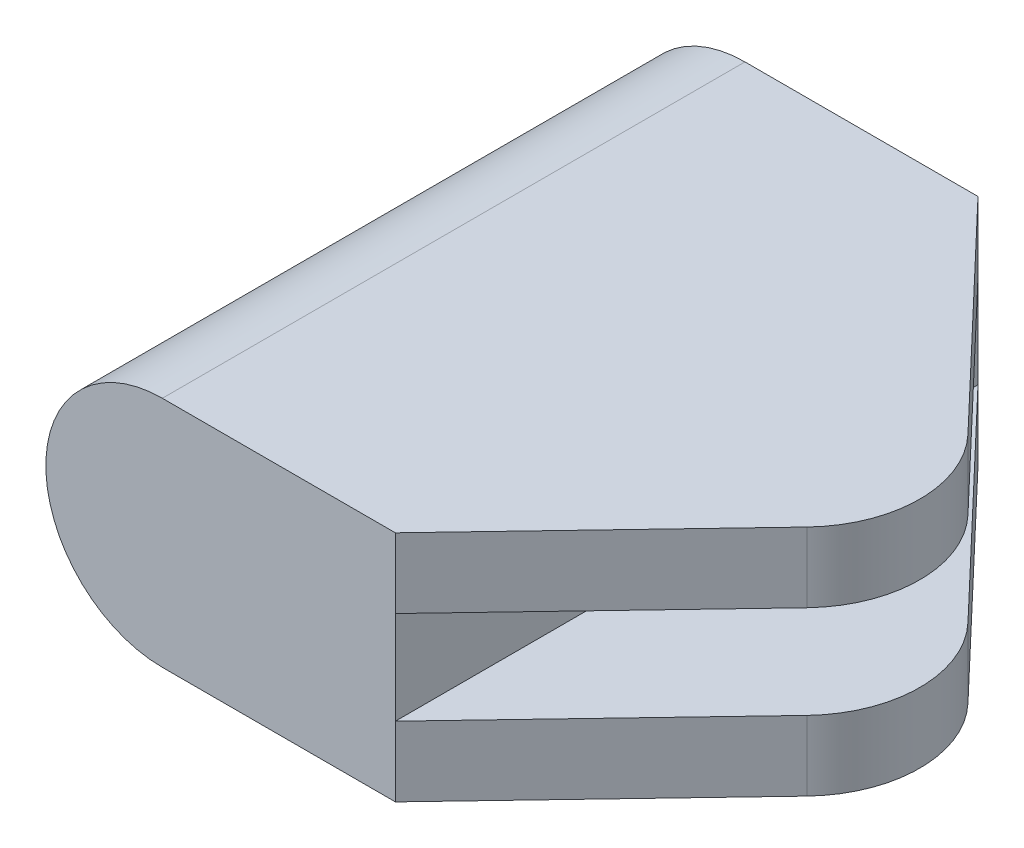
ISO-10303-21;
HEADER;
FILE_DESCRIPTION(('STEP AP214'),'2;1');
FILE_NAME('part.step','',(''),(''),'','','');
FILE_SCHEMA(('AUTOMOTIVE_DESIGN { 1 0 10303 214 1 1 1 1 }'));
ENDSEC;
DATA;
#1=APPLICATION_CONTEXT('core data for automotive mechanical design processes');
#2=APPLICATION_PROTOCOL_DEFINITION('international standard','automotive_design',2000,#1);
#3=PRODUCT_CONTEXT('',#1,'mechanical');
#4=PRODUCT('Part','Part','',(#3));
#5=PRODUCT_RELATED_PRODUCT_CATEGORY('part','',(#4));
#6=PRODUCT_DEFINITION_FORMATION('','',#4);
#7=PRODUCT_DEFINITION_CONTEXT('part definition',#1,'design');
#8=PRODUCT_DEFINITION('design','',#6,#7);
#9=PRODUCT_DEFINITION_SHAPE('','',#8);
#10=(LENGTH_UNIT() NAMED_UNIT(*) SI_UNIT(.MILLI.,.METRE.));
#11=(NAMED_UNIT(*) PLANE_ANGLE_UNIT() SI_UNIT($,.RADIAN.));
#12=(NAMED_UNIT(*) SI_UNIT($,.STERADIAN.) SOLID_ANGLE_UNIT());
#13=UNCERTAINTY_MEASURE_WITH_UNIT(LENGTH_MEASURE(1.E-05),#10,'distance_accuracy_value','');
#14=(GEOMETRIC_REPRESENTATION_CONTEXT(3) GLOBAL_UNCERTAINTY_ASSIGNED_CONTEXT((#13)) GLOBAL_UNIT_ASSIGNED_CONTEXT((#10,
#11,#12)) REPRESENTATION_CONTEXT('',''));
#15=CARTESIAN_POINT('',(0.,0.,0.));
#16=DIRECTION('',(0.,0.,1.));
#17=DIRECTION('',(1.,0.,0.));
#18=AXIS2_PLACEMENT_3D('',#15,#16,#17);
#19=CARTESIAN_POINT('',(60.,-80.,50.));
#20=DIRECTION('',(0.,1.,0.));
#21=DIRECTION('',(-1.,0.,0.));
#22=AXIS2_PLACEMENT_3D('',#19,#20,#21);
#23=CYLINDRICAL_SURFACE('',#22,19.9999997348555);
#24=CARTESIAN_POINT('',(60.,-8.00000000000001,50.));
#25=DIRECTION('',(0.,1.,0.));
#26=DIRECTION('',(0.,0.,1.));
#27=AXIS2_PLACEMENT_3D('',#24,#25,#26);
#28=CIRCLE('',#27,19.9999997348555);
#29=CARTESIAN_POINT('',(74.4827585018317,-8.00000000000001,63.7931031886171));
#30=VERTEX_POINT('',#29);
#31=CARTESIAN_POINT('',(74.4827585018318,-8.00000000000001,36.2068968113829));
#32=VERTEX_POINT('',#31);
#33=EDGE_CURVE('E116',#30,#32,#28,.T.);
#34=ORIENTED_EDGE('',*,*,#33,.F.);
#35=DIRECTION('',(0.,1.,0.));
#36=VECTOR('',#35,1.);
#37=CARTESIAN_POINT('',(74.4827585018317,-80.,63.7931031886171));
#38=LINE('',#37,#36);
#39=CARTESIAN_POINT('',(74.4827585018318,-20.,63.7931031886171));
#40=VERTEX_POINT('',#39);
#41=EDGE_CURVE('E159',#40,#30,#38,.T.);
#42=ORIENTED_EDGE('',*,*,#41,.F.);
#43=CARTESIAN_POINT('',(60.,-20.,50.));
#44=DIRECTION('',(0.,1.,0.));
#45=DIRECTION('',(-1.,0.,0.));
#46=AXIS2_PLACEMENT_3D('',#43,#44,#45);
#47=CIRCLE('',#46,19.9999997348555);
#48=CARTESIAN_POINT('',(74.4827585018318,-20.,36.2068968113829));
#49=VERTEX_POINT('',#48);
#50=EDGE_CURVE('E169',#49,#40,#47,.F.);
#51=ORIENTED_EDGE('',*,*,#50,.F.);
#52=DIRECTION('',(0.,1.,0.));
#53=VECTOR('',#52,1.);
#54=CARTESIAN_POINT('',(74.4827585018317,-80.,36.2068968113829));
#55=LINE('',#54,#53);
#56=EDGE_CURVE('E163',#49,#32,#55,.T.);
#57=ORIENTED_EDGE('',*,*,#56,.T.);
#58=EDGE_LOOP('',(#34,#42,#51,#57));
#59=FACE_BOUND('',#58,.T.);
#60=ADVANCED_FACE('F34',(#59),#23,.T.);
#61=CARTESIAN_POINT('',(40.,-80.,100.));
#62=DIRECTION('',(-0.724137934691649,0.,-0.689655168573769));
#63=DIRECTION('',(-0.689655168573769,0.,0.724137934691649));
#64=AXIS2_PLACEMENT_3D('',#61,#62,#63);
#65=PLANE('',#64);
#66=DIRECTION('',(0.689655168573769,0.,-0.724137934691649));
#67=VECTOR('',#66,1.);
#68=CARTESIAN_POINT('',(40.,-8.00000000000001,100.));
#69=LINE('',#68,#67);
#70=CARTESIAN_POINT('',(40.,-8.,100.));
#71=VERTEX_POINT('',#70);
#72=EDGE_CURVE('E147',#71,#30,#69,.T.);
#73=ORIENTED_EDGE('',*,*,#72,.F.);
#74=DIRECTION('',(0.,-1.,0.));
#75=VECTOR('',#74,1.);
#76=CARTESIAN_POINT('',(40.,0.,100.));
#77=LINE('',#76,#75);
#78=CARTESIAN_POINT('',(40.,-20.,100.));
#79=VERTEX_POINT('',#78);
#80=EDGE_CURVE('E191',#71,#79,#77,.T.);
#81=ORIENTED_EDGE('',*,*,#80,.T.);
#82=DIRECTION('',(-0.689655168573769,0.,0.724137934691649));
#83=VECTOR('',#82,1.);
#84=CARTESIAN_POINT('',(59.0249700616205,-20.,80.0237812231828));
#85=LINE('',#84,#83);
#86=EDGE_CURVE('E166',#40,#79,#85,.T.);
#87=ORIENTED_EDGE('',*,*,#86,.F.);
#88=ORIENTED_EDGE('',*,*,#41,.T.);
#89=EDGE_LOOP('',(#73,#81,#87,#88));
#90=FACE_BOUND('',#89,.T.);
#91=ADVANCED_FACE('F213',(#90),#65,.F.);
#92=CARTESIAN_POINT('',(40.,-80.,0.));
#93=DIRECTION('',(-0.724137934691649,0.,0.689655168573768));
#94=DIRECTION('',(0.689655168573769,0.,0.724137934691649));
#95=AXIS2_PLACEMENT_3D('',#92,#93,#94);
#96=PLANE('',#95);
#97=DIRECTION('',(-0.689655168573769,0.,-0.724137934691649));
#98=VECTOR('',#97,1.);
#99=CARTESIAN_POINT('',(40.,-8.00000000000001,0.));
#100=LINE('',#99,#98);
#101=CARTESIAN_POINT('',(40.,-8.,0.));
#102=VERTEX_POINT('',#101);
#103=EDGE_CURVE('E11',#32,#102,#100,.T.);
#104=ORIENTED_EDGE('',*,*,#103,.F.);
#105=ORIENTED_EDGE('',*,*,#56,.F.);
#106=DIRECTION('',(0.689655168573769,0.,0.724137934691649));
#107=VECTOR('',#106,1.);
#108=CARTESIAN_POINT('',(108.965517003663,-20.,72.4137936227659));
#109=LINE('',#108,#107);
#110=CARTESIAN_POINT('',(40.,-20.,0.));
#111=VERTEX_POINT('',#110);
#112=EDGE_CURVE('E129',#111,#49,#109,.T.);
#113=ORIENTED_EDGE('',*,*,#112,.F.);
#114=DIRECTION('',(0.,-1.,0.));
#115=VECTOR('',#114,1.);
#116=CARTESIAN_POINT('',(40.,0.,0.));
#117=LINE('',#116,#115);
#118=EDGE_CURVE('E57',#102,#111,#117,.T.);
#119=ORIENTED_EDGE('',*,*,#118,.F.);
#120=EDGE_LOOP('',(#104,#105,#113,#119));
#121=FACE_BOUND('',#120,.T.);
#122=ADVANCED_FACE('F127',(#121),#96,.F.);
#123=CARTESIAN_POINT('',(0.,0.,100.));
#124=DIRECTION('',(0.,0.,-1.));
#125=DIRECTION('',(-1.,0.,0.));
#126=AXIS2_PLACEMENT_3D('',#123,#124,#125);
#127=CYLINDRICAL_SURFACE('',#126,20.);
#128=CARTESIAN_POINT('',(0.,0.,0.));
#129=DIRECTION('',(0.,0.,1.));
#130=DIRECTION('',(1.,0.,0.));
#131=AXIS2_PLACEMENT_3D('',#128,#129,#130);
#132=CIRCLE('',#131,20.);
#133=CARTESIAN_POINT('',(0.,20.,0.));
#134=VERTEX_POINT('',#133);
#135=CARTESIAN_POINT('',(0.,-20.,0.));
#136=VERTEX_POINT('',#135);
#137=EDGE_CURVE('E171',#134,#136,#132,.T.);
#138=ORIENTED_EDGE('',*,*,#137,.T.);
#139=DIRECTION('',(0.,0.,-1.));
#140=VECTOR('',#139,1.);
#141=CARTESIAN_POINT('',(0.,-20.,100.));
#142=LINE('',#141,#140);
#143=CARTESIAN_POINT('',(0.,-20.,100.));
#144=VERTEX_POINT('',#143);
#145=EDGE_CURVE('E132',#144,#136,#142,.T.);
#146=ORIENTED_EDGE('',*,*,#145,.F.);
#147=CARTESIAN_POINT('',(0.,0.,100.));
#148=DIRECTION('',(0.,0.,1.));
#149=DIRECTION('',(1.,0.,0.));
#150=AXIS2_PLACEMENT_3D('',#147,#148,#149);
#151=CIRCLE('',#150,20.);
#152=CARTESIAN_POINT('',(0.,20.,100.));
#153=VERTEX_POINT('',#152);
#154=EDGE_CURVE('E172',#153,#144,#151,.T.);
#155=ORIENTED_EDGE('',*,*,#154,.F.);
#156=DIRECTION('',(0.,0.,-1.));
#157=VECTOR('',#156,1.);
#158=CARTESIAN_POINT('',(0.,20.,100.));
#159=LINE('',#158,#157);
#160=EDGE_CURVE('E181',#153,#134,#159,.T.);
#161=ORIENTED_EDGE('',*,*,#160,.T.);
#162=EDGE_LOOP('',(#138,#146,#155,#161));
#163=FACE_BOUND('',#162,.T.);
#164=ADVANCED_FACE('F36',(#163),#127,.T.);
#165=CARTESIAN_POINT('',(80.,-20.,100.));
#166=DIRECTION('',(0.,1.,0.));
#167=DIRECTION('',(-1.,0.,0.));
#168=AXIS2_PLACEMENT_3D('',#165,#166,#167);
#169=PLANE('',#168);
#170=ORIENTED_EDGE('',*,*,#50,.T.);
#171=ORIENTED_EDGE('',*,*,#86,.T.);
#172=DIRECTION('',(1.,0.,0.));
#173=VECTOR('',#172,1.);
#174=CARTESIAN_POINT('',(80.,-20.,100.));
#175=LINE('',#174,#173);
#176=EDGE_CURVE('E175',#144,#79,#175,.T.);
#177=ORIENTED_EDGE('',*,*,#176,.F.);
#178=ORIENTED_EDGE('',*,*,#145,.T.);
#179=DIRECTION('',(1.,0.,0.));
#180=VECTOR('',#179,1.);
#181=CARTESIAN_POINT('',(80.,-20.,0.));
#182=LINE('',#181,#180);
#183=EDGE_CURVE('E184',#136,#111,#182,.T.);
#184=ORIENTED_EDGE('',*,*,#183,.T.);
#185=ORIENTED_EDGE('',*,*,#112,.T.);
#186=EDGE_LOOP('',(#170,#171,#177,#178,#184,#185));
#187=FACE_BOUND('',#186,.T.);
#188=ADVANCED_FACE('F216',(#187),#169,.F.);
#189=CARTESIAN_POINT('',(0.,20.,100.));
#190=DIRECTION('',(0.,-1.,0.));
#191=DIRECTION('',(1.,0.,0.));
#192=AXIS2_PLACEMENT_3D('',#189,#190,#191);
#193=PLANE('',#192);
#194=DIRECTION('',(-1.,0.,0.));
#195=VECTOR('',#194,1.);
#196=CARTESIAN_POINT('',(0.,20.,100.));
#197=LINE('',#196,#195);
#198=CARTESIAN_POINT('',(40.,20.,100.));
#199=VERTEX_POINT('',#198);
#200=EDGE_CURVE('E179',#199,#153,#197,.T.);
#201=ORIENTED_EDGE('',*,*,#200,.F.);
#202=DIRECTION('',(-0.689655168573769,0.,0.724137934691649));
#203=VECTOR('',#202,1.);
#204=CARTESIAN_POINT('',(40.,20.,100.));
#205=LINE('',#204,#203);
#206=CARTESIAN_POINT('',(74.4827585018318,20.,63.7931031886171));
#207=VERTEX_POINT('',#206);
#208=EDGE_CURVE('E156',#207,#199,#205,.T.);
#209=ORIENTED_EDGE('',*,*,#208,.F.);
#210=CARTESIAN_POINT('',(60.,20.,50.));
#211=DIRECTION('',(0.,-1.,0.));
#212=DIRECTION('',(-1.,0.,0.));
#213=AXIS2_PLACEMENT_3D('',#210,#211,#212);
#214=CIRCLE('',#213,19.9999997348555);
#215=CARTESIAN_POINT('',(74.4827585018318,20.,36.2068968113829));
#216=VERTEX_POINT('',#215);
#217=EDGE_CURVE('E153',#216,#207,#214,.T.);
#218=ORIENTED_EDGE('',*,*,#217,.F.);
#219=DIRECTION('',(0.689655168573768,0.,0.724137934691649));
#220=VECTOR('',#219,1.);
#221=CARTESIAN_POINT('',(40.,20.,0.));
#222=LINE('',#221,#220);
#223=CARTESIAN_POINT('',(40.,20.,0.));
#224=VERTEX_POINT('',#223);
#225=EDGE_CURVE('E150',#224,#216,#222,.T.);
#226=ORIENTED_EDGE('',*,*,#225,.F.);
#227=DIRECTION('',(-1.,0.,0.));
#228=VECTOR('',#227,1.);
#229=CARTESIAN_POINT('',(0.,20.,0.));
#230=LINE('',#229,#228);
#231=EDGE_CURVE('E176',#224,#134,#230,.T.);
#232=ORIENTED_EDGE('',*,*,#231,.T.);
#233=ORIENTED_EDGE('',*,*,#160,.F.);
#234=EDGE_LOOP('',(#201,#209,#218,#226,#232,#233));
#235=FACE_BOUND('',#234,.T.);
#236=ADVANCED_FACE('F234',(#235),#193,.F.);
#237=CARTESIAN_POINT('',(0.,0.,100.));
#238=DIRECTION('',(0.,0.,1.));
#239=DIRECTION('',(1.,0.,0.));
#240=AXIS2_PLACEMENT_3D('',#237,#238,#239);
#241=PLANE('',#240);
#242=CARTESIAN_POINT('',(40.,8.,100.));
#243=VERTEX_POINT('',#242);
#244=EDGE_CURVE('E192',#199,#243,#77,.T.);
#245=ORIENTED_EDGE('',*,*,#244,.F.);
#246=ORIENTED_EDGE('',*,*,#200,.T.);
#247=ORIENTED_EDGE('',*,*,#154,.T.);
#248=ORIENTED_EDGE('',*,*,#176,.T.);
#249=ORIENTED_EDGE('',*,*,#80,.F.);
#250=DIRECTION('',(0.,1.,0.));
#251=VECTOR('',#250,1.);
#252=CARTESIAN_POINT('',(40.,-80.,100.));
#253=LINE('',#252,#251);
#254=EDGE_CURVE('E125',#71,#243,#253,.T.);
#255=ORIENTED_EDGE('',*,*,#254,.T.);
#256=EDGE_LOOP('',(#245,#246,#247,#248,#249,#255));
#257=FACE_BOUND('',#256,.T.);
#258=ADVANCED_FACE('F209',(#257),#241,.T.);
#259=CARTESIAN_POINT('',(0.,0.,0.));
#260=DIRECTION('',(0.,0.,1.));
#261=DIRECTION('',(1.,0.,0.));
#262=AXIS2_PLACEMENT_3D('',#259,#260,#261);
#263=PLANE('',#262);
#264=ORIENTED_EDGE('',*,*,#231,.F.);
#265=CARTESIAN_POINT('',(40.,8.00000000000001,0.));
#266=VERTEX_POINT('',#265);
#267=EDGE_CURVE('E131',#224,#266,#117,.T.);
#268=ORIENTED_EDGE('',*,*,#267,.T.);
#269=DIRECTION('',(0.,1.,0.));
#270=VECTOR('',#269,1.);
#271=CARTESIAN_POINT('',(40.,-8.,0.));
#272=LINE('',#271,#270);
#273=EDGE_CURVE('E122',#102,#266,#272,.T.);
#274=ORIENTED_EDGE('',*,*,#273,.F.);
#275=ORIENTED_EDGE('',*,*,#118,.T.);
#276=ORIENTED_EDGE('',*,*,#183,.F.);
#277=ORIENTED_EDGE('',*,*,#137,.F.);
#278=EDGE_LOOP('',(#264,#268,#274,#275,#276,#277));
#279=FACE_BOUND('',#278,.T.);
#280=ADVANCED_FACE('F136',(#279),#263,.F.);
#281=CARTESIAN_POINT('',(74.4827585018317,8.00000000000001,63.7931031886171));
#282=VERTEX_POINT('',#281);
#283=EDGE_CURVE('E162',#282,#207,#38,.T.);
#284=ORIENTED_EDGE('',*,*,#283,.F.);
#285=CARTESIAN_POINT('',(60.,8.00000000000001,50.));
#286=DIRECTION('',(0.,1.,0.));
#287=DIRECTION('',(0.,0.,1.));
#288=AXIS2_PLACEMENT_3D('',#285,#286,#287);
#289=CIRCLE('',#288,19.9999997348555);
#290=CARTESIAN_POINT('',(74.4827585018318,8.00000000000001,36.2068968113829));
#291=VERTEX_POINT('',#290);
#292=EDGE_CURVE('E137',#282,#291,#289,.T.);
#293=ORIENTED_EDGE('',*,*,#292,.T.);
#294=EDGE_CURVE('E158',#291,#216,#55,.T.);
#295=ORIENTED_EDGE('',*,*,#294,.T.);
#296=ORIENTED_EDGE('',*,*,#217,.T.);
#297=EDGE_LOOP('',(#284,#293,#295,#296));
#298=FACE_BOUND('',#297,.T.);
#299=ADVANCED_FACE('F201',(#298),#23,.T.);
#300=ORIENTED_EDGE('',*,*,#244,.T.);
#301=DIRECTION('',(0.689655168573769,0.,-0.724137934691649));
#302=VECTOR('',#301,1.);
#303=CARTESIAN_POINT('',(40.,8.00000000000001,100.));
#304=LINE('',#303,#302);
#305=EDGE_CURVE('E140',#243,#282,#304,.T.);
#306=ORIENTED_EDGE('',*,*,#305,.T.);
#307=ORIENTED_EDGE('',*,*,#283,.T.);
#308=ORIENTED_EDGE('',*,*,#208,.T.);
#309=EDGE_LOOP('',(#300,#306,#307,#308));
#310=FACE_BOUND('',#309,.T.);
#311=ADVANCED_FACE('F205',(#310),#65,.F.);
#312=ORIENTED_EDGE('',*,*,#294,.F.);
#313=DIRECTION('',(-0.689655168573769,0.,-0.724137934691649));
#314=VECTOR('',#313,1.);
#315=CARTESIAN_POINT('',(40.,8.00000000000001,0.));
#316=LINE('',#315,#314);
#317=EDGE_CURVE('E42',#291,#266,#316,.T.);
#318=ORIENTED_EDGE('',*,*,#317,.T.);
#319=ORIENTED_EDGE('',*,*,#267,.F.);
#320=ORIENTED_EDGE('',*,*,#225,.T.);
#321=EDGE_LOOP('',(#312,#318,#319,#320));
#322=FACE_BOUND('',#321,.T.);
#323=ADVANCED_FACE('F196',(#322),#96,.F.);
#324=CARTESIAN_POINT('',(40.,-8.,0.));
#325=DIRECTION('',(-1.,0.,0.));
#326=DIRECTION('',(0.,0.,1.));
#327=AXIS2_PLACEMENT_3D('',#324,#325,#326);
#328=PLANE('',#327);
#329=DIRECTION('',(0.,0.,1.));
#330=VECTOR('',#329,1.);
#331=CARTESIAN_POINT('',(40.,-8.,0.));
#332=LINE('',#331,#330);
#333=EDGE_CURVE('E113',#102,#71,#332,.T.);
#334=ORIENTED_EDGE('',*,*,#333,.F.);
#335=ORIENTED_EDGE('',*,*,#273,.T.);
#336=DIRECTION('',(0.,0.,1.));
#337=VECTOR('',#336,1.);
#338=CARTESIAN_POINT('',(40.,8.,0.));
#339=LINE('',#338,#337);
#340=EDGE_CURVE('E49',#266,#243,#339,.T.);
#341=ORIENTED_EDGE('',*,*,#340,.T.);
#342=ORIENTED_EDGE('',*,*,#254,.F.);
#343=EDGE_LOOP('',(#334,#335,#341,#342));
#344=FACE_BOUND('',#343,.T.);
#345=ADVANCED_FACE('F121',(#344),#328,.F.);
#346=CARTESIAN_POINT('',(0.,-8.,0.));
#347=DIRECTION('',(0.,1.,0.));
#348=DIRECTION('',(0.,0.,1.));
#349=AXIS2_PLACEMENT_3D('',#346,#347,#348);
#350=PLANE('',#349);
#351=ORIENTED_EDGE('',*,*,#72,.T.);
#352=ORIENTED_EDGE('',*,*,#33,.T.);
#353=ORIENTED_EDGE('',*,*,#103,.T.);
#354=ORIENTED_EDGE('',*,*,#333,.T.);
#355=EDGE_LOOP('',(#351,#352,#353,#354));
#356=FACE_BOUND('',#355,.T.);
#357=ADVANCED_FACE('F112',(#356),#350,.T.);
#358=CARTESIAN_POINT('',(0.,8.,0.));
#359=DIRECTION('',(0.,1.,0.));
#360=DIRECTION('',(0.,0.,1.));
#361=AXIS2_PLACEMENT_3D('',#358,#359,#360);
#362=PLANE('',#361);
#363=ORIENTED_EDGE('',*,*,#340,.F.);
#364=ORIENTED_EDGE('',*,*,#317,.F.);
#365=ORIENTED_EDGE('',*,*,#292,.F.);
#366=ORIENTED_EDGE('',*,*,#305,.F.);
#367=EDGE_LOOP('',(#363,#364,#365,#366));
#368=FACE_BOUND('',#367,.T.);
#369=ADVANCED_FACE('F198',(#368),#362,.F.);
#370=CLOSED_SHELL('',(#60,#91,#122,#164,#188,#236,#258,#280,#299,#311,#323,#345,#357,#369));
#371=MANIFOLD_SOLID_BREP('B2',#370);
#372=ADVANCED_BREP_SHAPE_REPRESENTATION('',(#18,#371),#14);
#373=SHAPE_DEFINITION_REPRESENTATION(#9,#372);
ENDSEC;
END-ISO-10303-21;
